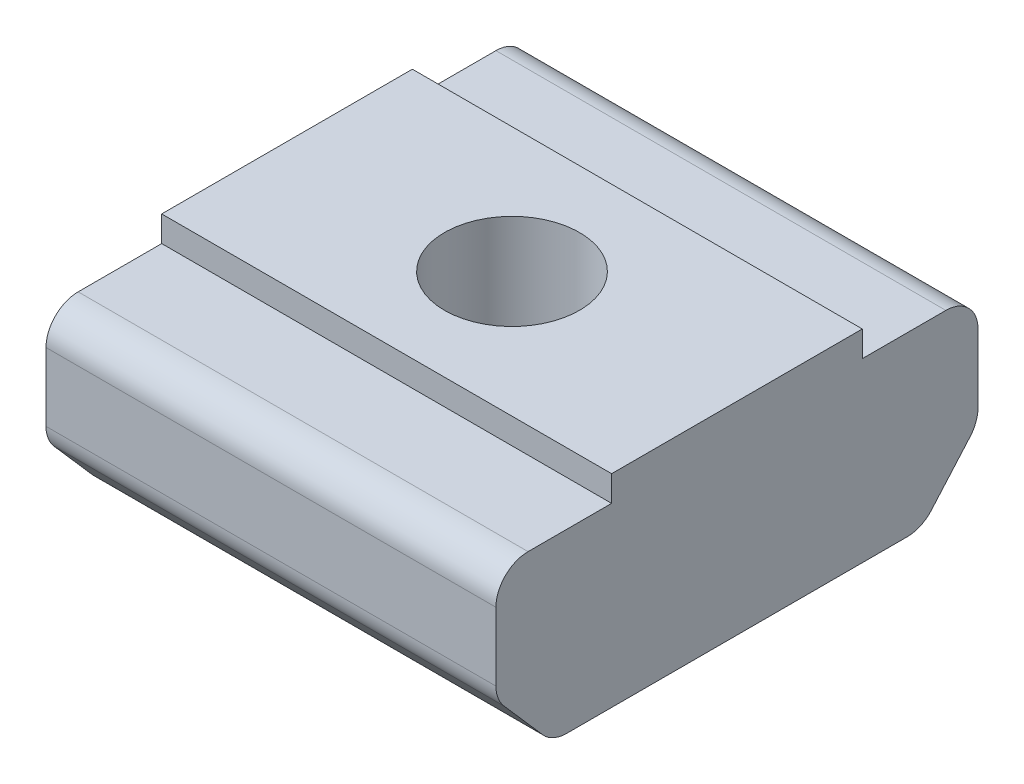
ISO-10303-21;
HEADER;
FILE_DESCRIPTION(('STEP AP214'),'2;1');
FILE_NAME('part.step','',(''),(''),'','','');
FILE_SCHEMA(('AUTOMOTIVE_DESIGN { 1 0 10303 214 1 1 1 1 }'));
ENDSEC;
DATA;
#1=APPLICATION_CONTEXT('core data for automotive mechanical design processes');
#2=APPLICATION_PROTOCOL_DEFINITION('international standard','automotive_design',2000,#1);
#3=PRODUCT_CONTEXT('',#1,'mechanical');
#4=PRODUCT('Part','Part','',(#3));
#5=PRODUCT_RELATED_PRODUCT_CATEGORY('part','',(#4));
#6=PRODUCT_DEFINITION_FORMATION('','',#4);
#7=PRODUCT_DEFINITION_CONTEXT('part definition',#1,'design');
#8=PRODUCT_DEFINITION('design','',#6,#7);
#9=PRODUCT_DEFINITION_SHAPE('','',#8);
#10=(LENGTH_UNIT() NAMED_UNIT(*) SI_UNIT(.MILLI.,.METRE.));
#11=(NAMED_UNIT(*) PLANE_ANGLE_UNIT() SI_UNIT($,.RADIAN.));
#12=(NAMED_UNIT(*) SI_UNIT($,.STERADIAN.) SOLID_ANGLE_UNIT());
#13=UNCERTAINTY_MEASURE_WITH_UNIT(LENGTH_MEASURE(1.E-05),#10,'distance_accuracy_value','');
#14=(GEOMETRIC_REPRESENTATION_CONTEXT(3) GLOBAL_UNCERTAINTY_ASSIGNED_CONTEXT((#13)) GLOBAL_UNIT_ASSIGNED_CONTEXT((#10,
#11,#12)) REPRESENTATION_CONTEXT('',''));
#15=CARTESIAN_POINT('',(0.,0.,0.));
#16=DIRECTION('',(0.,0.,1.));
#17=DIRECTION('',(1.,0.,0.));
#18=AXIS2_PLACEMENT_3D('',#15,#16,#17);
#19=CARTESIAN_POINT('',(7.,-0.800000000000002,3.9));
#20=DIRECTION('',(0.,0.,-1.));
#21=DIRECTION('',(-1.,0.,0.));
#22=AXIS2_PLACEMENT_3D('',#19,#20,#21);
#23=PLANE('',#22);
#24=DIRECTION('',(0.,-1.,0.));
#25=VECTOR('',#24,1.);
#26=CARTESIAN_POINT('',(-7.,-0.800000000000002,3.9));
#27=LINE('',#26,#25);
#28=CARTESIAN_POINT('',(-7.,0.,3.9));
#29=VERTEX_POINT('',#28);
#30=CARTESIAN_POINT('',(-7.,-0.800000000000002,3.9));
#31=VERTEX_POINT('',#30);
#32=EDGE_CURVE('E174',#29,#31,#27,.T.);
#33=ORIENTED_EDGE('',*,*,#32,.T.);
#34=DIRECTION('',(-1.,0.,0.));
#35=VECTOR('',#34,1.);
#36=CARTESIAN_POINT('',(7.,-0.800000000000002,3.9));
#37=LINE('',#36,#35);
#38=CARTESIAN_POINT('',(7.,-0.800000000000002,3.9));
#39=VERTEX_POINT('',#38);
#40=EDGE_CURVE('E156',#39,#31,#37,.T.);
#41=ORIENTED_EDGE('',*,*,#40,.F.);
#42=DIRECTION('',(0.,-1.,0.));
#43=VECTOR('',#42,1.);
#44=CARTESIAN_POINT('',(7.,-0.800000000000002,3.9));
#45=LINE('',#44,#43);
#46=CARTESIAN_POINT('',(7.,0.,3.9));
#47=VERTEX_POINT('',#46);
#48=EDGE_CURVE('E162',#47,#39,#45,.T.);
#49=ORIENTED_EDGE('',*,*,#48,.F.);
#50=DIRECTION('',(-1.,0.,0.));
#51=VECTOR('',#50,1.);
#52=CARTESIAN_POINT('',(7.,0.,3.9));
#53=LINE('',#52,#51);
#54=EDGE_CURVE('E251',#47,#29,#53,.T.);
#55=ORIENTED_EDGE('',*,*,#54,.T.);
#56=EDGE_LOOP('',(#33,#41,#49,#55));
#57=FACE_BOUND('',#56,.T.);
#58=ADVANCED_FACE('F36',(#57),#23,.F.);
#59=CARTESIAN_POINT('',(7.,-0.800000000000002,7.5));
#60=DIRECTION('',(0.,-1.,0.));
#61=DIRECTION('',(0.,0.,-1.));
#62=AXIS2_PLACEMENT_3D('',#59,#60,#61);
#63=PLANE('',#62);
#64=DIRECTION('',(0.,0.,1.));
#65=VECTOR('',#64,1.);
#66=CARTESIAN_POINT('',(-7.,-0.800000000000002,7.5));
#67=LINE('',#66,#65);
#68=CARTESIAN_POINT('',(-7.,-0.800000000000002,6.5));
#69=VERTEX_POINT('',#68);
#70=EDGE_CURVE('E260',#31,#69,#67,.T.);
#71=ORIENTED_EDGE('',*,*,#70,.T.);
#72=DIRECTION('',(-1.,0.,0.));
#73=VECTOR('',#72,1.);
#74=CARTESIAN_POINT('',(7.,-0.800000000000002,6.5));
#75=LINE('',#74,#73);
#76=CARTESIAN_POINT('',(7.,-0.800000000000002,6.5));
#77=VERTEX_POINT('',#76);
#78=EDGE_CURVE('E159',#69,#77,#75,.F.);
#79=ORIENTED_EDGE('',*,*,#78,.T.);
#80=DIRECTION('',(0.,0.,1.));
#81=VECTOR('',#80,1.);
#82=CARTESIAN_POINT('',(7.,-0.800000000000002,7.5));
#83=LINE('',#82,#81);
#84=EDGE_CURVE('E151',#39,#77,#83,.T.);
#85=ORIENTED_EDGE('',*,*,#84,.F.);
#86=ORIENTED_EDGE('',*,*,#40,.T.);
#87=EDGE_LOOP('',(#71,#79,#85,#86));
#88=FACE_BOUND('',#87,.T.);
#89=ADVANCED_FACE('F154',(#88),#63,.F.);
#90=CARTESIAN_POINT('',(7.,-0.800000000000002,7.5));
#91=DIRECTION('',(0.,0.,-1.));
#92=DIRECTION('',(0.,1.,0.));
#93=AXIS2_PLACEMENT_3D('',#90,#91,#92);
#94=PLANE('',#93);
#95=DIRECTION('',(0.,-1.,0.));
#96=VECTOR('',#95,1.);
#97=CARTESIAN_POINT('',(7.,-0.800000000000002,7.5));
#98=LINE('',#97,#96);
#99=CARTESIAN_POINT('',(7.,-1.8,7.5));
#100=VERTEX_POINT('',#99);
#101=CARTESIAN_POINT('',(7.,-3.92426488389505,7.5));
#102=VERTEX_POINT('',#101);
#103=EDGE_CURVE('E161',#100,#102,#98,.T.);
#104=ORIENTED_EDGE('',*,*,#103,.F.);
#105=DIRECTION('',(-1.,0.,0.));
#106=VECTOR('',#105,1.);
#107=CARTESIAN_POINT('',(7.,-1.8,7.5));
#108=LINE('',#107,#106);
#109=CARTESIAN_POINT('',(-7.,-1.8,7.5));
#110=VERTEX_POINT('',#109);
#111=EDGE_CURVE('E178',#100,#110,#108,.T.);
#112=ORIENTED_EDGE('',*,*,#111,.T.);
#113=DIRECTION('',(0.,-1.,0.));
#114=VECTOR('',#113,1.);
#115=CARTESIAN_POINT('',(-7.,-0.800000000000002,7.5));
#116=LINE('',#115,#114);
#117=CARTESIAN_POINT('',(-7.,-3.92426488389505,7.5));
#118=VERTEX_POINT('',#117);
#119=EDGE_CURVE('E263',#110,#118,#116,.T.);
#120=ORIENTED_EDGE('',*,*,#119,.T.);
#121=DIRECTION('',(-1.,0.,0.));
#122=VECTOR('',#121,1.);
#123=CARTESIAN_POINT('',(7.,-3.92426488389505,7.5));
#124=LINE('',#123,#122);
#125=EDGE_CURVE('E175',#118,#102,#124,.F.);
#126=ORIENTED_EDGE('',*,*,#125,.T.);
#127=EDGE_LOOP('',(#104,#112,#120,#126));
#128=FACE_BOUND('',#127,.T.);
#129=ADVANCED_FACE('F322',(#128),#94,.F.);
#130=CARTESIAN_POINT('',(7.,-4.3,7.5));
#131=DIRECTION('',(0.,0.658504607868518,-0.752576694706878));
#132=DIRECTION('',(0.,0.752576694706878,0.658504607868518));
#133=AXIS2_PLACEMENT_3D('',#130,#131,#132);
#134=PLANE('',#133);
#135=DIRECTION('',(0.,-0.752576694706877,-0.658504607868518));
#136=VECTOR('',#135,1.);
#137=CARTESIAN_POINT('',(7.,-4.3,7.5));
#138=LINE('',#137,#136);
#139=CARTESIAN_POINT('',(7.,-4.58276949176357,7.25257669470688));
#140=VERTEX_POINT('',#139);
#141=CARTESIAN_POINT('',(7.,-5.95850460786852,6.04880846811505));
#142=VERTEX_POINT('',#141);
#143=EDGE_CURVE('E297',#140,#142,#138,.T.);
#144=ORIENTED_EDGE('',*,*,#143,.F.);
#145=DIRECTION('',(-1.,0.,0.));
#146=VECTOR('',#145,1.);
#147=CARTESIAN_POINT('',(7.,-4.58276949176357,7.25257669470688));
#148=LINE('',#147,#146);
#149=CARTESIAN_POINT('',(-7.,-4.58276949176357,7.25257669470688));
#150=VERTEX_POINT('',#149);
#151=EDGE_CURVE('E213',#140,#150,#148,.T.);
#152=ORIENTED_EDGE('',*,*,#151,.T.);
#153=DIRECTION('',(0.,-0.752576694706877,-0.658504607868518));
#154=VECTOR('',#153,1.);
#155=CARTESIAN_POINT('',(-7.,-4.3,7.5));
#156=LINE('',#155,#154);
#157=CARTESIAN_POINT('',(-7.,-5.95850460786852,6.04880846811505));
#158=VERTEX_POINT('',#157);
#159=EDGE_CURVE('E273',#150,#158,#156,.T.);
#160=ORIENTED_EDGE('',*,*,#159,.T.);
#161=DIRECTION('',(-1.,0.,0.));
#162=VECTOR('',#161,1.);
#163=CARTESIAN_POINT('',(7.,-5.95850460786852,6.04880846811505));
#164=LINE('',#163,#162);
#165=EDGE_CURVE('E211',#158,#142,#164,.F.);
#166=ORIENTED_EDGE('',*,*,#165,.T.);
#167=EDGE_LOOP('',(#144,#152,#160,#166));
#168=FACE_BOUND('',#167,.T.);
#169=ADVANCED_FACE('F361',(#168),#134,.F.);
#170=CARTESIAN_POINT('',(7.,-6.3,-5.75));
#171=DIRECTION('',(0.,1.,0.));
#172=DIRECTION('',(0.,0.,1.));
#173=AXIS2_PLACEMENT_3D('',#170,#171,#172);
#174=PLANE('',#173);
#175=CARTESIAN_POINT('',(0.,-6.3,0.));
#176=DIRECTION('',(0.,1.,0.));
#177=DIRECTION('',(0.,0.,1.));
#178=AXIS2_PLACEMENT_3D('',#175,#176,#177);
#179=CIRCLE('',#178,2.1);
#180=CARTESIAN_POINT('',(0.,-6.3,2.1));
#181=VERTEX_POINT('',#180);
#182=EDGE_CURVE('E261',#181,#181,#179,.T.);
#183=ORIENTED_EDGE('',*,*,#182,.T.);
#184=EDGE_LOOP('',(#183));
#185=FACE_BOUND('',#184,.T.);
#186=DIRECTION('',(0.,0.,-1.));
#187=VECTOR('',#186,1.);
#188=CARTESIAN_POINT('',(7.,-6.3,-5.75));
#189=LINE('',#188,#187);
#190=CARTESIAN_POINT('',(7.,-6.3,5.29623177340817));
#191=VERTEX_POINT('',#190);
#192=CARTESIAN_POINT('',(7.,-6.3,-5.29623177340817));
#193=VERTEX_POINT('',#192);
#194=EDGE_CURVE('E290',#191,#193,#189,.T.);
#195=ORIENTED_EDGE('',*,*,#194,.F.);
#196=DIRECTION('',(-1.,0.,0.));
#197=VECTOR('',#196,1.);
#198=CARTESIAN_POINT('',(7.,-6.3,5.29623177340817));
#199=LINE('',#198,#197);
#200=CARTESIAN_POINT('',(-7.,-6.3,5.29623177340817));
#201=VERTEX_POINT('',#200);
#202=EDGE_CURVE('E218',#191,#201,#199,.T.);
#203=ORIENTED_EDGE('',*,*,#202,.T.);
#204=DIRECTION('',(0.,0.,-1.));
#205=VECTOR('',#204,1.);
#206=CARTESIAN_POINT('',(-7.,-6.3,-5.75));
#207=LINE('',#206,#205);
#208=CARTESIAN_POINT('',(-7.,-6.3,-5.29623177340817));
#209=VERTEX_POINT('',#208);
#210=EDGE_CURVE('E245',#201,#209,#207,.T.);
#211=ORIENTED_EDGE('',*,*,#210,.T.);
#212=DIRECTION('',(-1.,0.,0.));
#213=VECTOR('',#212,1.);
#214=CARTESIAN_POINT('',(7.,-6.3,-5.29623177340817));
#215=LINE('',#214,#213);
#216=EDGE_CURVE('E216',#209,#193,#215,.F.);
#217=ORIENTED_EDGE('',*,*,#216,.T.);
#218=EDGE_LOOP('',(#195,#203,#211,#217));
#219=FACE_BOUND('',#218,.T.);
#220=ADVANCED_FACE('F280',(#185,#219),#174,.F.);
#221=CARTESIAN_POINT('',(7.,-4.3,-7.5));
#222=DIRECTION('',(0.,0.658504607868518,0.752576694706878));
#223=DIRECTION('',(0.,-0.752576694706878,0.658504607868518));
#224=AXIS2_PLACEMENT_3D('',#221,#222,#223);
#225=PLANE('',#224);
#226=DIRECTION('',(0.,0.752576694706877,-0.658504607868518));
#227=VECTOR('',#226,1.);
#228=CARTESIAN_POINT('',(7.,-4.3,-7.5));
#229=LINE('',#228,#227);
#230=CARTESIAN_POINT('',(7.,-5.95850460786852,-6.04880846811505));
#231=VERTEX_POINT('',#230);
#232=CARTESIAN_POINT('',(7.,-4.58276949176357,-7.25257669470688));
#233=VERTEX_POINT('',#232);
#234=EDGE_CURVE('E289',#231,#233,#229,.T.);
#235=ORIENTED_EDGE('',*,*,#234,.F.);
#236=DIRECTION('',(-1.,0.,0.));
#237=VECTOR('',#236,1.);
#238=CARTESIAN_POINT('',(7.,-5.95850460786852,-6.04880846811505));
#239=LINE('',#238,#237);
#240=CARTESIAN_POINT('',(-7.,-5.95850460786852,-6.04880846811505));
#241=VERTEX_POINT('',#240);
#242=EDGE_CURVE('E223',#231,#241,#239,.T.);
#243=ORIENTED_EDGE('',*,*,#242,.T.);
#244=DIRECTION('',(0.,0.752576694706877,-0.658504607868518));
#245=VECTOR('',#244,1.);
#246=CARTESIAN_POINT('',(-7.,-4.3,-7.5));
#247=LINE('',#246,#245);
#248=CARTESIAN_POINT('',(-7.,-4.58276949176357,-7.25257669470688));
#249=VERTEX_POINT('',#248);
#250=EDGE_CURVE('E241',#241,#249,#247,.T.);
#251=ORIENTED_EDGE('',*,*,#250,.T.);
#252=DIRECTION('',(-1.,0.,0.));
#253=VECTOR('',#252,1.);
#254=CARTESIAN_POINT('',(7.,-4.58276949176357,-7.25257669470688));
#255=LINE('',#254,#253);
#256=EDGE_CURVE('E221',#249,#233,#255,.F.);
#257=ORIENTED_EDGE('',*,*,#256,.T.);
#258=EDGE_LOOP('',(#235,#243,#251,#257));
#259=FACE_BOUND('',#258,.T.);
#260=ADVANCED_FACE('F292',(#259),#225,.F.);
#261=CARTESIAN_POINT('',(7.,-0.8,-7.5));
#262=DIRECTION('',(0.,0.,1.));
#263=DIRECTION('',(0.,-1.,0.));
#264=AXIS2_PLACEMENT_3D('',#261,#262,#263);
#265=PLANE('',#264);
#266=DIRECTION('',(0.,1.,0.));
#267=VECTOR('',#266,1.);
#268=CARTESIAN_POINT('',(7.,-0.8,-7.5));
#269=LINE('',#268,#267);
#270=CARTESIAN_POINT('',(7.,-3.92426488389505,-7.5));
#271=VERTEX_POINT('',#270);
#272=CARTESIAN_POINT('',(7.,-1.8,-7.5));
#273=VERTEX_POINT('',#272);
#274=EDGE_CURVE('E231',#271,#273,#269,.T.);
#275=ORIENTED_EDGE('',*,*,#274,.F.);
#276=DIRECTION('',(-1.,0.,0.));
#277=VECTOR('',#276,1.);
#278=CARTESIAN_POINT('',(7.,-3.92426488389505,-7.5));
#279=LINE('',#278,#277);
#280=CARTESIAN_POINT('',(-7.,-3.92426488389505,-7.5));
#281=VERTEX_POINT('',#280);
#282=EDGE_CURVE('E44',#271,#281,#279,.T.);
#283=ORIENTED_EDGE('',*,*,#282,.T.);
#284=DIRECTION('',(0.,1.,0.));
#285=VECTOR('',#284,1.);
#286=CARTESIAN_POINT('',(-7.,-0.8,-7.5));
#287=LINE('',#286,#285);
#288=CARTESIAN_POINT('',(-7.,-1.8,-7.5));
#289=VERTEX_POINT('',#288);
#290=EDGE_CURVE('E230',#281,#289,#287,.T.);
#291=ORIENTED_EDGE('',*,*,#290,.T.);
#292=DIRECTION('',(-1.,0.,0.));
#293=VECTOR('',#292,1.);
#294=CARTESIAN_POINT('',(7.,-1.8,-7.5));
#295=LINE('',#294,#293);
#296=EDGE_CURVE('E59',#289,#273,#295,.F.);
#297=ORIENTED_EDGE('',*,*,#296,.T.);
#298=EDGE_LOOP('',(#275,#283,#291,#297));
#299=FACE_BOUND('',#298,.T.);
#300=ADVANCED_FACE('F229',(#299),#265,.F.);
#301=CARTESIAN_POINT('',(7.,-0.800000000000001,-3.9));
#302=DIRECTION('',(0.,-1.,0.));
#303=DIRECTION('',(0.,0.,-1.));
#304=AXIS2_PLACEMENT_3D('',#301,#302,#303);
#305=PLANE('',#304);
#306=DIRECTION('',(0.,0.,1.));
#307=VECTOR('',#306,1.);
#308=CARTESIAN_POINT('',(7.,-0.800000000000001,-3.9));
#309=LINE('',#308,#307);
#310=CARTESIAN_POINT('',(7.,-0.8,-6.5));
#311=VERTEX_POINT('',#310);
#312=CARTESIAN_POINT('',(7.,-0.800000000000001,-3.9));
#313=VERTEX_POINT('',#312);
#314=EDGE_CURVE('E295',#311,#313,#309,.T.);
#315=ORIENTED_EDGE('',*,*,#314,.F.);
#316=DIRECTION('',(-1.,0.,0.));
#317=VECTOR('',#316,1.);
#318=CARTESIAN_POINT('',(7.,-0.8,-6.5));
#319=LINE('',#318,#317);
#320=CARTESIAN_POINT('',(-7.,-0.8,-6.5));
#321=VERTEX_POINT('',#320);
#322=EDGE_CURVE('E11',#311,#321,#319,.T.);
#323=ORIENTED_EDGE('',*,*,#322,.T.);
#324=DIRECTION('',(0.,0.,1.));
#325=VECTOR('',#324,1.);
#326=CARTESIAN_POINT('',(-7.,-0.800000000000001,-3.9));
#327=LINE('',#326,#325);
#328=CARTESIAN_POINT('',(-7.,-0.800000000000001,-3.9));
#329=VERTEX_POINT('',#328);
#330=EDGE_CURVE('E240',#321,#329,#327,.T.);
#331=ORIENTED_EDGE('',*,*,#330,.T.);
#332=DIRECTION('',(-1.,0.,0.));
#333=VECTOR('',#332,1.);
#334=CARTESIAN_POINT('',(7.,-0.800000000000001,-3.9));
#335=LINE('',#334,#333);
#336=EDGE_CURVE('E176',#313,#329,#335,.T.);
#337=ORIENTED_EDGE('',*,*,#336,.F.);
#338=EDGE_LOOP('',(#315,#323,#331,#337));
#339=FACE_BOUND('',#338,.T.);
#340=ADVANCED_FACE('F305',(#339),#305,.F.);
#341=CARTESIAN_POINT('',(7.,0.,-3.9));
#342=DIRECTION('',(0.,0.,1.));
#343=DIRECTION('',(1.,0.,0.));
#344=AXIS2_PLACEMENT_3D('',#341,#342,#343);
#345=PLANE('',#344);
#346=DIRECTION('',(0.,1.,0.));
#347=VECTOR('',#346,1.);
#348=CARTESIAN_POINT('',(-7.,0.,-3.9));
#349=LINE('',#348,#347);
#350=CARTESIAN_POINT('',(-7.,0.,-3.9));
#351=VERTEX_POINT('',#350);
#352=EDGE_CURVE('E243',#329,#351,#349,.T.);
#353=ORIENTED_EDGE('',*,*,#352,.T.);
#354=DIRECTION('',(-1.,0.,0.));
#355=VECTOR('',#354,1.);
#356=CARTESIAN_POINT('',(7.,0.,-3.9));
#357=LINE('',#356,#355);
#358=CARTESIAN_POINT('',(7.,0.,-3.9));
#359=VERTEX_POINT('',#358);
#360=EDGE_CURVE('E181',#359,#351,#357,.T.);
#361=ORIENTED_EDGE('',*,*,#360,.F.);
#362=DIRECTION('',(0.,1.,0.));
#363=VECTOR('',#362,1.);
#364=CARTESIAN_POINT('',(7.,0.,-3.9));
#365=LINE('',#364,#363);
#366=EDGE_CURVE('E301',#313,#359,#365,.T.);
#367=ORIENTED_EDGE('',*,*,#366,.F.);
#368=ORIENTED_EDGE('',*,*,#336,.T.);
#369=EDGE_LOOP('',(#353,#361,#367,#368));
#370=FACE_BOUND('',#369,.T.);
#371=ADVANCED_FACE('F303',(#370),#345,.F.);
#372=CARTESIAN_POINT('',(7.,0.,3.9));
#373=DIRECTION('',(0.,-1.,0.));
#374=DIRECTION('',(0.,0.,-1.));
#375=AXIS2_PLACEMENT_3D('',#372,#373,#374);
#376=PLANE('',#375);
#377=CARTESIAN_POINT('',(0.,0.,0.));
#378=DIRECTION('',(0.,1.,0.));
#379=DIRECTION('',(0.,0.,1.));
#380=AXIS2_PLACEMENT_3D('',#377,#378,#379);
#381=CIRCLE('',#380,2.1);
#382=CARTESIAN_POINT('',(0.,0.,2.1));
#383=VERTEX_POINT('',#382);
#384=EDGE_CURVE('E266',#383,#383,#381,.T.);
#385=ORIENTED_EDGE('',*,*,#384,.F.);
#386=EDGE_LOOP('',(#385));
#387=FACE_BOUND('',#386,.T.);
#388=DIRECTION('',(0.,0.,1.));
#389=VECTOR('',#388,1.);
#390=CARTESIAN_POINT('',(-7.,0.,3.9));
#391=LINE('',#390,#389);
#392=EDGE_CURVE('E171',#351,#29,#391,.T.);
#393=ORIENTED_EDGE('',*,*,#392,.T.);
#394=ORIENTED_EDGE('',*,*,#54,.F.);
#395=DIRECTION('',(0.,0.,1.));
#396=VECTOR('',#395,1.);
#397=CARTESIAN_POINT('',(7.,0.,3.9));
#398=LINE('',#397,#396);
#399=EDGE_CURVE('E167',#359,#47,#398,.T.);
#400=ORIENTED_EDGE('',*,*,#399,.F.);
#401=ORIENTED_EDGE('',*,*,#360,.T.);
#402=EDGE_LOOP('',(#393,#394,#400,#401));
#403=FACE_BOUND('',#402,.T.);
#404=ADVANCED_FACE('F256',(#387,#403),#376,.F.);
#405=CARTESIAN_POINT('',(7.,0.,0.));
#406=DIRECTION('',(-1.,0.,0.));
#407=DIRECTION('',(0.,0.,1.));
#408=AXIS2_PLACEMENT_3D('',#405,#406,#407);
#409=PLANE('',#408);
#410=ORIENTED_EDGE('',*,*,#84,.T.);
#411=CARTESIAN_POINT('',(7.,-1.8,6.5));
#412=DIRECTION('',(-1.,0.,0.));
#413=DIRECTION('',(0.,0.,1.));
#414=AXIS2_PLACEMENT_3D('',#411,#412,#413);
#415=CIRCLE('',#414,1.);
#416=EDGE_CURVE('E209',#77,#100,#415,.F.);
#417=ORIENTED_EDGE('',*,*,#416,.T.);
#418=ORIENTED_EDGE('',*,*,#103,.T.);
#419=CARTESIAN_POINT('',(7.,-3.92426488389505,6.5));
#420=DIRECTION('',(-1.,0.,0.));
#421=DIRECTION('',(0.,0.,1.));
#422=AXIS2_PLACEMENT_3D('',#419,#420,#421);
#423=CIRCLE('',#422,1.);
#424=EDGE_CURVE('E207',#102,#140,#423,.F.);
#425=ORIENTED_EDGE('',*,*,#424,.T.);
#426=ORIENTED_EDGE('',*,*,#143,.T.);
#427=CARTESIAN_POINT('',(7.,-5.3,5.29623177340817));
#428=DIRECTION('',(-1.,0.,0.));
#429=DIRECTION('',(0.,0.,1.));
#430=AXIS2_PLACEMENT_3D('',#427,#428,#429);
#431=CIRCLE('',#430,1.);
#432=EDGE_CURVE('E205',#142,#191,#431,.F.);
#433=ORIENTED_EDGE('',*,*,#432,.T.);
#434=ORIENTED_EDGE('',*,*,#194,.T.);
#435=CARTESIAN_POINT('',(7.,-5.3,-5.29623177340817));
#436=DIRECTION('',(-1.,0.,0.));
#437=DIRECTION('',(0.,0.,1.));
#438=AXIS2_PLACEMENT_3D('',#435,#436,#437);
#439=CIRCLE('',#438,1.);
#440=EDGE_CURVE('E203',#193,#231,#439,.F.);
#441=ORIENTED_EDGE('',*,*,#440,.T.);
#442=ORIENTED_EDGE('',*,*,#234,.T.);
#443=CARTESIAN_POINT('',(7.,-3.92426488389505,-6.5));
#444=DIRECTION('',(-1.,0.,0.));
#445=DIRECTION('',(0.,0.,1.));
#446=AXIS2_PLACEMENT_3D('',#443,#444,#445);
#447=CIRCLE('',#446,1.);
#448=EDGE_CURVE('E201',#233,#271,#447,.F.);
#449=ORIENTED_EDGE('',*,*,#448,.T.);
#450=ORIENTED_EDGE('',*,*,#274,.T.);
#451=CARTESIAN_POINT('',(7.,-1.8,-6.5));
#452=DIRECTION('',(-1.,0.,0.));
#453=DIRECTION('',(0.,0.,1.));
#454=AXIS2_PLACEMENT_3D('',#451,#452,#453);
#455=CIRCLE('',#454,1.);
#456=EDGE_CURVE('E51',#273,#311,#455,.F.);
#457=ORIENTED_EDGE('',*,*,#456,.T.);
#458=ORIENTED_EDGE('',*,*,#314,.T.);
#459=ORIENTED_EDGE('',*,*,#366,.T.);
#460=ORIENTED_EDGE('',*,*,#399,.T.);
#461=ORIENTED_EDGE('',*,*,#48,.T.);
#462=EDGE_LOOP('',(#410,#417,#418,#425,#426,#433,#434,#441,#442,#449,#450,#457,#458,#459,#460,#461));
#463=FACE_BOUND('',#462,.T.);
#464=ADVANCED_FACE('F165',(#463),#409,.F.);
#465=CARTESIAN_POINT('',(-7.,0.,0.));
#466=DIRECTION('',(-1.,0.,0.));
#467=DIRECTION('',(0.,0.,1.));
#468=AXIS2_PLACEMENT_3D('',#465,#466,#467);
#469=PLANE('',#468);
#470=ORIENTED_EDGE('',*,*,#119,.F.);
#471=CARTESIAN_POINT('',(-7.,-1.8,6.5));
#472=DIRECTION('',(-1.,0.,0.));
#473=DIRECTION('',(0.,0.,1.));
#474=AXIS2_PLACEMENT_3D('',#471,#472,#473);
#475=CIRCLE('',#474,1.);
#476=EDGE_CURVE('E197',#110,#69,#475,.T.);
#477=ORIENTED_EDGE('',*,*,#476,.T.);
#478=ORIENTED_EDGE('',*,*,#70,.F.);
#479=ORIENTED_EDGE('',*,*,#32,.F.);
#480=ORIENTED_EDGE('',*,*,#392,.F.);
#481=ORIENTED_EDGE('',*,*,#352,.F.);
#482=ORIENTED_EDGE('',*,*,#330,.F.);
#483=CARTESIAN_POINT('',(-7.,-1.8,-6.5));
#484=DIRECTION('',(-1.,0.,0.));
#485=DIRECTION('',(0.,0.,1.));
#486=AXIS2_PLACEMENT_3D('',#483,#484,#485);
#487=CIRCLE('',#486,1.);
#488=EDGE_CURVE('E187',#321,#289,#487,.T.);
#489=ORIENTED_EDGE('',*,*,#488,.T.);
#490=ORIENTED_EDGE('',*,*,#290,.F.);
#491=CARTESIAN_POINT('',(-7.,-3.92426488389505,-6.5));
#492=DIRECTION('',(-1.,0.,0.));
#493=DIRECTION('',(0.,0.,1.));
#494=AXIS2_PLACEMENT_3D('',#491,#492,#493);
#495=CIRCLE('',#494,1.);
#496=EDGE_CURVE('E189',#281,#249,#495,.T.);
#497=ORIENTED_EDGE('',*,*,#496,.T.);
#498=ORIENTED_EDGE('',*,*,#250,.F.);
#499=CARTESIAN_POINT('',(-7.,-5.3,-5.29623177340817));
#500=DIRECTION('',(-1.,0.,0.));
#501=DIRECTION('',(0.,0.,1.));
#502=AXIS2_PLACEMENT_3D('',#499,#500,#501);
#503=CIRCLE('',#502,1.);
#504=EDGE_CURVE('E191',#241,#209,#503,.T.);
#505=ORIENTED_EDGE('',*,*,#504,.T.);
#506=ORIENTED_EDGE('',*,*,#210,.F.);
#507=CARTESIAN_POINT('',(-7.,-5.3,5.29623177340817));
#508=DIRECTION('',(-1.,0.,0.));
#509=DIRECTION('',(0.,0.,1.));
#510=AXIS2_PLACEMENT_3D('',#507,#508,#509);
#511=CIRCLE('',#510,1.);
#512=EDGE_CURVE('E193',#201,#158,#511,.T.);
#513=ORIENTED_EDGE('',*,*,#512,.T.);
#514=ORIENTED_EDGE('',*,*,#159,.F.);
#515=CARTESIAN_POINT('',(-7.,-3.92426488389505,6.5));
#516=DIRECTION('',(-1.,0.,0.));
#517=DIRECTION('',(0.,0.,1.));
#518=AXIS2_PLACEMENT_3D('',#515,#516,#517);
#519=CIRCLE('',#518,1.);
#520=EDGE_CURVE('E195',#150,#118,#519,.T.);
#521=ORIENTED_EDGE('',*,*,#520,.T.);
#522=EDGE_LOOP('',(#470,#477,#478,#479,#480,#481,#482,#489,#490,#497,#498,#505,#506,#513,#514,#521));
#523=FACE_BOUND('',#522,.T.);
#524=ADVANCED_FACE('F236',(#523),#469,.T.);
#525=CARTESIAN_POINT('',(7.,-1.8,6.5));
#526=DIRECTION('',(-1.,0.,0.));
#527=DIRECTION('',(0.,0.,1.));
#528=AXIS2_PLACEMENT_3D('',#525,#526,#527);
#529=CYLINDRICAL_SURFACE('',#528,1.);
#530=ORIENTED_EDGE('',*,*,#416,.F.);
#531=ORIENTED_EDGE('',*,*,#78,.F.);
#532=ORIENTED_EDGE('',*,*,#476,.F.);
#533=ORIENTED_EDGE('',*,*,#111,.F.);
#534=EDGE_LOOP('',(#530,#531,#532,#533));
#535=FACE_BOUND('',#534,.T.);
#536=ADVANCED_FACE('F326',(#535),#529,.T.);
#537=CARTESIAN_POINT('',(7.,-3.92426488389505,6.5));
#538=DIRECTION('',(-1.,0.,0.));
#539=DIRECTION('',(0.,0.,1.));
#540=AXIS2_PLACEMENT_3D('',#537,#538,#539);
#541=CYLINDRICAL_SURFACE('',#540,1.);
#542=ORIENTED_EDGE('',*,*,#424,.F.);
#543=ORIENTED_EDGE('',*,*,#125,.F.);
#544=ORIENTED_EDGE('',*,*,#520,.F.);
#545=ORIENTED_EDGE('',*,*,#151,.F.);
#546=EDGE_LOOP('',(#542,#543,#544,#545));
#547=FACE_BOUND('',#546,.T.);
#548=ADVANCED_FACE('F329',(#547),#541,.T.);
#549=CARTESIAN_POINT('',(7.,-5.3,5.29623177340817));
#550=DIRECTION('',(-1.,0.,0.));
#551=DIRECTION('',(0.,0.,1.));
#552=AXIS2_PLACEMENT_3D('',#549,#550,#551);
#553=CYLINDRICAL_SURFACE('',#552,1.);
#554=ORIENTED_EDGE('',*,*,#432,.F.);
#555=ORIENTED_EDGE('',*,*,#165,.F.);
#556=ORIENTED_EDGE('',*,*,#512,.F.);
#557=ORIENTED_EDGE('',*,*,#202,.F.);
#558=EDGE_LOOP('',(#554,#555,#556,#557));
#559=FACE_BOUND('',#558,.T.);
#560=ADVANCED_FACE('F333',(#559),#553,.T.);
#561=CARTESIAN_POINT('',(7.,-5.3,-5.29623177340817));
#562=DIRECTION('',(-1.,0.,0.));
#563=DIRECTION('',(0.,0.,1.));
#564=AXIS2_PLACEMENT_3D('',#561,#562,#563);
#565=CYLINDRICAL_SURFACE('',#564,1.);
#566=ORIENTED_EDGE('',*,*,#440,.F.);
#567=ORIENTED_EDGE('',*,*,#216,.F.);
#568=ORIENTED_EDGE('',*,*,#504,.F.);
#569=ORIENTED_EDGE('',*,*,#242,.F.);
#570=EDGE_LOOP('',(#566,#567,#568,#569));
#571=FACE_BOUND('',#570,.T.);
#572=ADVANCED_FACE('F285',(#571),#565,.T.);
#573=CARTESIAN_POINT('',(7.,-3.92426488389505,-6.5));
#574=DIRECTION('',(-1.,0.,0.));
#575=DIRECTION('',(0.,0.,1.));
#576=AXIS2_PLACEMENT_3D('',#573,#574,#575);
#577=CYLINDRICAL_SURFACE('',#576,1.);
#578=ORIENTED_EDGE('',*,*,#448,.F.);
#579=ORIENTED_EDGE('',*,*,#256,.F.);
#580=ORIENTED_EDGE('',*,*,#496,.F.);
#581=ORIENTED_EDGE('',*,*,#282,.F.);
#582=EDGE_LOOP('',(#578,#579,#580,#581));
#583=FACE_BOUND('',#582,.T.);
#584=ADVANCED_FACE('F310',(#583),#577,.T.);
#585=CARTESIAN_POINT('',(7.,-1.8,-6.5));
#586=DIRECTION('',(-1.,0.,0.));
#587=DIRECTION('',(0.,0.,1.));
#588=AXIS2_PLACEMENT_3D('',#585,#586,#587);
#589=CYLINDRICAL_SURFACE('',#588,1.);
#590=ORIENTED_EDGE('',*,*,#456,.F.);
#591=ORIENTED_EDGE('',*,*,#296,.F.);
#592=ORIENTED_EDGE('',*,*,#488,.F.);
#593=ORIENTED_EDGE('',*,*,#322,.F.);
#594=EDGE_LOOP('',(#590,#591,#592,#593));
#595=FACE_BOUND('',#594,.T.);
#596=ADVANCED_FACE('F38',(#595),#589,.T.);
#597=CARTESIAN_POINT('',(0.,0.,0.));
#598=DIRECTION('',(0.,1.,0.));
#599=DIRECTION('',(0.,0.,1.));
#600=AXIS2_PLACEMENT_3D('',#597,#598,#599);
#601=CYLINDRICAL_SURFACE('',#600,2.1);
#602=ORIENTED_EDGE('',*,*,#182,.F.);
#603=EDGE_LOOP('',(#602));
#604=FACE_BOUND('',#603,.T.);
#605=ORIENTED_EDGE('',*,*,#384,.T.);
#606=EDGE_LOOP('',(#605));
#607=FACE_BOUND('',#606,.T.);
#608=ADVANCED_FACE('F309',(#604,#607),#601,.F.);
#609=CLOSED_SHELL('',(#58,#89,#129,#169,#220,#260,#300,#340,#371,#404,#464,#524,#536,#548,#560,
#572,#584,#596,#608));
#610=MANIFOLD_SOLID_BREP('B2',#609);
#611=ADVANCED_BREP_SHAPE_REPRESENTATION('',(#18,#610),#14);
#612=SHAPE_DEFINITION_REPRESENTATION(#9,#611);
ENDSEC;
END-ISO-10303-21;
